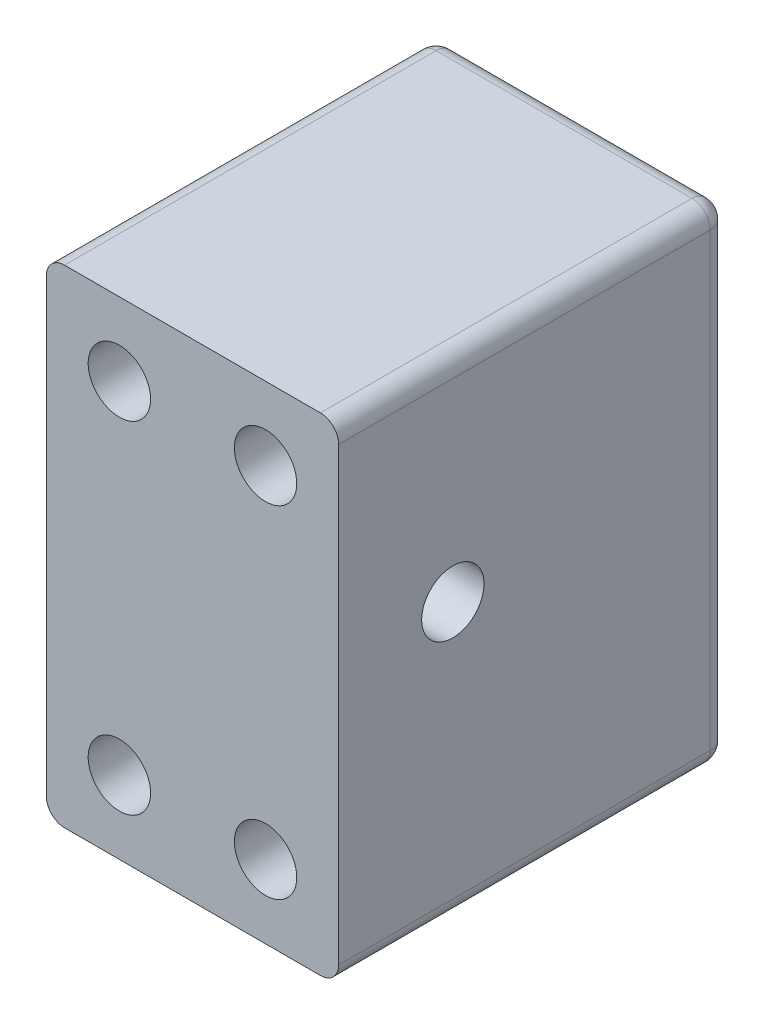
ISO-10303-21;
HEADER;
FILE_DESCRIPTION(('STEP AP214'),'2;1');
FILE_NAME('part.step','',(''),(''),'','','');
FILE_SCHEMA(('AUTOMOTIVE_DESIGN { 1 0 10303 214 1 1 1 1 }'));
ENDSEC;
DATA;
#1=APPLICATION_CONTEXT('core data for automotive mechanical design processes');
#2=APPLICATION_PROTOCOL_DEFINITION('international standard','automotive_design',2000,#1);
#3=PRODUCT_CONTEXT('',#1,'mechanical');
#4=PRODUCT('Part','Part','',(#3));
#5=PRODUCT_RELATED_PRODUCT_CATEGORY('part','',(#4));
#6=PRODUCT_DEFINITION_FORMATION('','',#4);
#7=PRODUCT_DEFINITION_CONTEXT('part definition',#1,'design');
#8=PRODUCT_DEFINITION('design','',#6,#7);
#9=PRODUCT_DEFINITION_SHAPE('','',#8);
#10=(LENGTH_UNIT() NAMED_UNIT(*) SI_UNIT(.MILLI.,.METRE.));
#11=(NAMED_UNIT(*) PLANE_ANGLE_UNIT() SI_UNIT($,.RADIAN.));
#12=(NAMED_UNIT(*) SI_UNIT($,.STERADIAN.) SOLID_ANGLE_UNIT());
#13=UNCERTAINTY_MEASURE_WITH_UNIT(LENGTH_MEASURE(1.E-05),#10,'distance_accuracy_value','');
#14=(GEOMETRIC_REPRESENTATION_CONTEXT(3) GLOBAL_UNCERTAINTY_ASSIGNED_CONTEXT((#13)) GLOBAL_UNIT_ASSIGNED_CONTEXT((#10,
#11,#12)) REPRESENTATION_CONTEXT('',''));
#15=CARTESIAN_POINT('',(0.,0.,0.));
#16=DIRECTION('',(0.,0.,1.));
#17=DIRECTION('',(1.,0.,0.));
#18=AXIS2_PLACEMENT_3D('',#15,#16,#17);
#19=CARTESIAN_POINT('',(0.,0.,25.4));
#20=DIRECTION('',(0.,0.,-1.));
#21=DIRECTION('',(-1.,0.,0.));
#22=AXIS2_PLACEMENT_3D('',#19,#20,#21);
#23=PLANE('',#22);
#24=DIRECTION('',(0.,-1.,0.));
#25=VECTOR('',#24,1.);
#26=CARTESIAN_POINT('',(0.,0.,25.4));
#27=LINE('',#26,#25);
#28=CARTESIAN_POINT('',(0.,30.559375,25.4));
#29=VERTEX_POINT('',#28);
#30=CARTESIAN_POINT('',(0.,1.190625,25.4));
#31=VERTEX_POINT('',#30);
#32=EDGE_CURVE('E155',#29,#31,#27,.T.);
#33=ORIENTED_EDGE('',*,*,#32,.T.);
#34=CARTESIAN_POINT('',(1.190625,1.190625,25.4));
#35=DIRECTION('',(0.,0.,-1.));
#36=DIRECTION('',(-1.,0.,0.));
#37=AXIS2_PLACEMENT_3D('',#34,#35,#36);
#38=CIRCLE('',#37,1.190625);
#39=CARTESIAN_POINT('',(1.190625,0.,25.4));
#40=VERTEX_POINT('',#39);
#41=EDGE_CURVE('E149',#31,#40,#38,.F.);
#42=ORIENTED_EDGE('',*,*,#41,.T.);
#43=DIRECTION('',(1.,0.,0.));
#44=VECTOR('',#43,1.);
#45=CARTESIAN_POINT('',(0.,0.,25.4));
#46=LINE('',#45,#44);
#47=CARTESIAN_POINT('',(17.859375,0.,25.4));
#48=VERTEX_POINT('',#47);
#49=EDGE_CURVE('E148',#40,#48,#46,.T.);
#50=ORIENTED_EDGE('',*,*,#49,.T.);
#51=CARTESIAN_POINT('',(17.859375,1.190625,25.4));
#52=DIRECTION('',(0.,0.,-1.));
#53=DIRECTION('',(-1.,0.,0.));
#54=AXIS2_PLACEMENT_3D('',#51,#52,#53);
#55=CIRCLE('',#54,1.190625);
#56=CARTESIAN_POINT('',(19.05,1.190625,25.4));
#57=VERTEX_POINT('',#56);
#58=EDGE_CURVE('E159',#48,#57,#55,.F.);
#59=ORIENTED_EDGE('',*,*,#58,.T.);
#60=DIRECTION('',(0.,1.,0.));
#61=VECTOR('',#60,1.);
#62=CARTESIAN_POINT('',(19.05,0.,25.4));
#63=LINE('',#62,#61);
#64=CARTESIAN_POINT('',(19.05,30.559375,25.4));
#65=VERTEX_POINT('',#64);
#66=EDGE_CURVE('E170',#57,#65,#63,.T.);
#67=ORIENTED_EDGE('',*,*,#66,.T.);
#68=CARTESIAN_POINT('',(17.859375,30.559375,25.4));
#69=DIRECTION('',(0.,0.,-1.));
#70=DIRECTION('',(-1.,0.,0.));
#71=AXIS2_PLACEMENT_3D('',#68,#69,#70);
#72=CIRCLE('',#71,1.190625);
#73=CARTESIAN_POINT('',(17.859375,31.75,25.4));
#74=VERTEX_POINT('',#73);
#75=EDGE_CURVE('E194',#65,#74,#72,.F.);
#76=ORIENTED_EDGE('',*,*,#75,.T.);
#77=DIRECTION('',(-1.,0.,0.));
#78=VECTOR('',#77,1.);
#79=CARTESIAN_POINT('',(0.,31.75,25.4));
#80=LINE('',#79,#78);
#81=CARTESIAN_POINT('',(1.190625,31.75,25.4));
#82=VERTEX_POINT('',#81);
#83=EDGE_CURVE('E312',#74,#82,#80,.T.);
#84=ORIENTED_EDGE('',*,*,#83,.T.);
#85=CARTESIAN_POINT('',(1.190625,30.559375,25.4));
#86=DIRECTION('',(0.,0.,-1.));
#87=DIRECTION('',(-1.,0.,0.));
#88=AXIS2_PLACEMENT_3D('',#85,#86,#87);
#89=CIRCLE('',#88,1.190625);
#90=EDGE_CURVE('E193',#82,#29,#89,.F.);
#91=ORIENTED_EDGE('',*,*,#90,.T.);
#92=EDGE_LOOP('',(#33,#42,#50,#59,#67,#76,#84,#91));
#93=FACE_BOUND('',#92,.T.);
#94=CARTESIAN_POINT('',(4.7625,26.9875,25.4));
#95=DIRECTION('',(0.,0.,1.));
#96=DIRECTION('',(1.,0.,0.));
#97=AXIS2_PLACEMENT_3D('',#94,#95,#96);
#98=CIRCLE('',#97,2.032);
#99=CARTESIAN_POINT('',(6.7945,26.9875,25.4));
#100=VERTEX_POINT('',#99);
#101=EDGE_CURVE('E305',#100,#100,#98,.T.);
#102=ORIENTED_EDGE('',*,*,#101,.F.);
#103=EDGE_LOOP('',(#102));
#104=FACE_BOUND('',#103,.T.);
#105=CARTESIAN_POINT('',(14.2875,26.9875,25.4));
#106=DIRECTION('',(0.,0.,1.));
#107=DIRECTION('',(1.,0.,0.));
#108=AXIS2_PLACEMENT_3D('',#105,#106,#107);
#109=CIRCLE('',#108,2.032);
#110=CARTESIAN_POINT('',(16.3195,26.9875,25.4));
#111=VERTEX_POINT('',#110);
#112=EDGE_CURVE('E295',#111,#111,#109,.T.);
#113=ORIENTED_EDGE('',*,*,#112,.F.);
#114=EDGE_LOOP('',(#113));
#115=FACE_BOUND('',#114,.T.);
#116=CARTESIAN_POINT('',(4.76250000000001,4.7625,25.4));
#117=DIRECTION('',(0.,0.,1.));
#118=DIRECTION('',(1.,0.,0.));
#119=AXIS2_PLACEMENT_3D('',#116,#117,#118);
#120=CIRCLE('',#119,2.032);
#121=CARTESIAN_POINT('',(6.79450000000001,4.7625,25.4));
#122=VERTEX_POINT('',#121);
#123=EDGE_CURVE('E290',#122,#122,#120,.T.);
#124=ORIENTED_EDGE('',*,*,#123,.F.);
#125=EDGE_LOOP('',(#124));
#126=FACE_BOUND('',#125,.T.);
#127=CARTESIAN_POINT('',(14.2875,4.7625,25.4));
#128=DIRECTION('',(0.,0.,1.));
#129=DIRECTION('',(1.,0.,0.));
#130=AXIS2_PLACEMENT_3D('',#127,#128,#129);
#131=CIRCLE('',#130,2.032);
#132=CARTESIAN_POINT('',(16.3195,4.7625,25.4));
#133=VERTEX_POINT('',#132);
#134=EDGE_CURVE('E278',#133,#133,#131,.T.);
#135=ORIENTED_EDGE('',*,*,#134,.F.);
#136=EDGE_LOOP('',(#135));
#137=FACE_BOUND('',#136,.T.);
#138=ADVANCED_FACE('F44',(#93,#104,#115,#126,#137),#23,.F.);
#139=CARTESIAN_POINT('',(0.,0.,0.));
#140=DIRECTION('',(0.,0.,-1.));
#141=DIRECTION('',(-1.,0.,0.));
#142=AXIS2_PLACEMENT_3D('',#139,#140,#141);
#143=PLANE('',#142);
#144=DIRECTION('',(0.,-1.,0.));
#145=VECTOR('',#144,1.);
#146=CARTESIAN_POINT('',(1.190625,31.75,0.));
#147=LINE('',#146,#145);
#148=CARTESIAN_POINT('',(1.190625,1.190625,0.));
#149=VERTEX_POINT('',#148);
#150=CARTESIAN_POINT('',(1.190625,30.559375,0.));
#151=VERTEX_POINT('',#150);
#152=EDGE_CURVE('E73',#149,#151,#147,.F.);
#153=ORIENTED_EDGE('',*,*,#152,.T.);
#154=DIRECTION('',(-1.,0.,0.));
#155=VECTOR('',#154,1.);
#156=CARTESIAN_POINT('',(19.05,30.559375,0.));
#157=LINE('',#156,#155);
#158=CARTESIAN_POINT('',(17.859375,30.559375,0.));
#159=VERTEX_POINT('',#158);
#160=EDGE_CURVE('E11',#151,#159,#157,.F.);
#161=ORIENTED_EDGE('',*,*,#160,.T.);
#162=DIRECTION('',(0.,1.,0.));
#163=VECTOR('',#162,1.);
#164=CARTESIAN_POINT('',(17.859375,0.,0.));
#165=LINE('',#164,#163);
#166=CARTESIAN_POINT('',(17.859375,1.190625,0.));
#167=VERTEX_POINT('',#166);
#168=EDGE_CURVE('E54',#159,#167,#165,.F.);
#169=ORIENTED_EDGE('',*,*,#168,.T.);
#170=DIRECTION('',(1.,0.,0.));
#171=VECTOR('',#170,1.);
#172=CARTESIAN_POINT('',(0.,1.190625,0.));
#173=LINE('',#172,#171);
#174=EDGE_CURVE('E213',#167,#149,#173,.F.);
#175=ORIENTED_EDGE('',*,*,#174,.T.);
#176=EDGE_LOOP('',(#153,#161,#169,#175));
#177=FACE_BOUND('',#176,.T.);
#178=CARTESIAN_POINT('',(4.76250000000001,4.7625,0.));
#179=DIRECTION('',(0.,0.,1.));
#180=DIRECTION('',(1.,0.,0.));
#181=AXIS2_PLACEMENT_3D('',#178,#179,#180);
#182=CIRCLE('',#181,2.032);
#183=CARTESIAN_POINT('',(6.79450000000001,4.7625,0.));
#184=VERTEX_POINT('',#183);
#185=EDGE_CURVE('E282',#184,#184,#182,.T.);
#186=ORIENTED_EDGE('',*,*,#185,.T.);
#187=EDGE_LOOP('',(#186));
#188=FACE_BOUND('',#187,.T.);
#189=CARTESIAN_POINT('',(4.7625,26.9875,0.));
#190=DIRECTION('',(0.,0.,1.));
#191=DIRECTION('',(1.,0.,0.));
#192=AXIS2_PLACEMENT_3D('',#189,#190,#191);
#193=CIRCLE('',#192,2.032);
#194=CARTESIAN_POINT('',(6.7945,26.9875,0.));
#195=VERTEX_POINT('',#194);
#196=EDGE_CURVE('E296',#195,#195,#193,.T.);
#197=ORIENTED_EDGE('',*,*,#196,.T.);
#198=EDGE_LOOP('',(#197));
#199=FACE_BOUND('',#198,.T.);
#200=CARTESIAN_POINT('',(14.2875,26.9875,0.));
#201=DIRECTION('',(0.,0.,1.));
#202=DIRECTION('',(1.,0.,0.));
#203=AXIS2_PLACEMENT_3D('',#200,#201,#202);
#204=CIRCLE('',#203,2.032);
#205=CARTESIAN_POINT('',(16.3195,26.9875,0.));
#206=VERTEX_POINT('',#205);
#207=EDGE_CURVE('E288',#206,#206,#204,.T.);
#208=ORIENTED_EDGE('',*,*,#207,.T.);
#209=EDGE_LOOP('',(#208));
#210=FACE_BOUND('',#209,.T.);
#211=CARTESIAN_POINT('',(14.2875,4.7625,0.));
#212=DIRECTION('',(0.,0.,1.));
#213=DIRECTION('',(1.,0.,0.));
#214=AXIS2_PLACEMENT_3D('',#211,#212,#213);
#215=CIRCLE('',#214,2.032);
#216=CARTESIAN_POINT('',(16.3195,4.7625,0.));
#217=VERTEX_POINT('',#216);
#218=EDGE_CURVE('E279',#217,#217,#215,.T.);
#219=ORIENTED_EDGE('',*,*,#218,.T.);
#220=EDGE_LOOP('',(#219));
#221=FACE_BOUND('',#220,.T.);
#222=ADVANCED_FACE('F328',(#177,#188,#199,#210,#221),#143,.T.);
#223=CARTESIAN_POINT('',(0.,0.,25.4));
#224=DIRECTION('',(1.,0.,0.));
#225=DIRECTION('',(0.,0.,-1.));
#226=AXIS2_PLACEMENT_3D('',#223,#224,#225);
#227=PLANE('',#226);
#228=CARTESIAN_POINT('',(0.,17.9605122421382,17.9605122421384));
#229=DIRECTION('',(-1.,0.,0.));
#230=DIRECTION('',(0.,0.,1.));
#231=AXIS2_PLACEMENT_3D('',#228,#229,#230);
#232=CIRCLE('',#231,2.032);
#233=CARTESIAN_POINT('',(0.,17.9605122421382,19.9925122421384));
#234=VERTEX_POINT('',#233);
#235=EDGE_CURVE('E265',#234,#234,#232,.T.);
#236=ORIENTED_EDGE('',*,*,#235,.F.);
#237=EDGE_LOOP('',(#236));
#238=FACE_BOUND('',#237,.T.);
#239=DIRECTION('',(0.,-1.,0.));
#240=VECTOR('',#239,1.);
#241=CARTESIAN_POINT('',(0.,0.,1.190625));
#242=LINE('',#241,#240);
#243=CARTESIAN_POINT('',(0.,30.559375,1.190625));
#244=VERTEX_POINT('',#243);
#245=CARTESIAN_POINT('',(0.,1.190625,1.190625));
#246=VERTEX_POINT('',#245);
#247=EDGE_CURVE('E172',#244,#246,#242,.T.);
#248=ORIENTED_EDGE('',*,*,#247,.T.);
#249=DIRECTION('',(0.,0.,-1.));
#250=VECTOR('',#249,1.);
#251=CARTESIAN_POINT('',(0.,1.190625,25.4));
#252=LINE('',#251,#250);
#253=EDGE_CURVE('E189',#246,#31,#252,.F.);
#254=ORIENTED_EDGE('',*,*,#253,.T.);
#255=ORIENTED_EDGE('',*,*,#32,.F.);
#256=DIRECTION('',(0.,0.,-1.));
#257=VECTOR('',#256,1.);
#258=CARTESIAN_POINT('',(0.,30.559375,25.4));
#259=LINE('',#258,#257);
#260=EDGE_CURVE('E177',#29,#244,#259,.T.);
#261=ORIENTED_EDGE('',*,*,#260,.T.);
#262=EDGE_LOOP('',(#248,#254,#255,#261));
#263=FACE_BOUND('',#262,.T.);
#264=ADVANCED_FACE('F360',(#238,#263),#227,.F.);
#265=CARTESIAN_POINT('',(0.,0.,25.4));
#266=DIRECTION('',(0.,1.,0.));
#267=DIRECTION('',(0.,0.,1.));
#268=AXIS2_PLACEMENT_3D('',#265,#266,#267);
#269=PLANE('',#268);
#270=ORIENTED_EDGE('',*,*,#49,.F.);
#271=DIRECTION('',(0.,0.,-1.));
#272=VECTOR('',#271,1.);
#273=CARTESIAN_POINT('',(1.190625,0.,25.4));
#274=LINE('',#273,#272);
#275=CARTESIAN_POINT('',(1.190625,0.,1.190625));
#276=VERTEX_POINT('',#275);
#277=EDGE_CURVE('E161',#40,#276,#274,.T.);
#278=ORIENTED_EDGE('',*,*,#277,.T.);
#279=DIRECTION('',(1.,0.,0.));
#280=VECTOR('',#279,1.);
#281=CARTESIAN_POINT('',(19.05,0.,1.190625));
#282=LINE('',#281,#280);
#283=CARTESIAN_POINT('',(17.859375,0.,1.190625));
#284=VERTEX_POINT('',#283);
#285=EDGE_CURVE('E185',#276,#284,#282,.T.);
#286=ORIENTED_EDGE('',*,*,#285,.T.);
#287=DIRECTION('',(0.,0.,-1.));
#288=VECTOR('',#287,1.);
#289=CARTESIAN_POINT('',(17.859375,0.,25.4));
#290=LINE('',#289,#288);
#291=EDGE_CURVE('E164',#284,#48,#290,.F.);
#292=ORIENTED_EDGE('',*,*,#291,.T.);
#293=EDGE_LOOP('',(#270,#278,#286,#292));
#294=FACE_BOUND('',#293,.T.);
#295=ADVANCED_FACE('F162',(#294),#269,.F.);
#296=CARTESIAN_POINT('',(19.05,0.,25.4));
#297=DIRECTION('',(-1.,0.,0.));
#298=DIRECTION('',(0.,0.,1.));
#299=AXIS2_PLACEMENT_3D('',#296,#297,#298);
#300=PLANE('',#299);
#301=ORIENTED_EDGE('',*,*,#66,.F.);
#302=DIRECTION('',(0.,0.,-1.));
#303=VECTOR('',#302,1.);
#304=CARTESIAN_POINT('',(19.05,1.190625,25.4));
#305=LINE('',#304,#303);
#306=CARTESIAN_POINT('',(19.05,1.190625,1.190625));
#307=VERTEX_POINT('',#306);
#308=EDGE_CURVE('E204',#57,#307,#305,.T.);
#309=ORIENTED_EDGE('',*,*,#308,.T.);
#310=DIRECTION('',(0.,1.,0.));
#311=VECTOR('',#310,1.);
#312=CARTESIAN_POINT('',(19.05,31.75,1.190625));
#313=LINE('',#312,#311);
#314=CARTESIAN_POINT('',(19.05,30.559375,1.190625));
#315=VERTEX_POINT('',#314);
#316=EDGE_CURVE('E160',#307,#315,#313,.T.);
#317=ORIENTED_EDGE('',*,*,#316,.T.);
#318=DIRECTION('',(0.,0.,-1.));
#319=VECTOR('',#318,1.);
#320=CARTESIAN_POINT('',(19.05,30.559375,25.4));
#321=LINE('',#320,#319);
#322=EDGE_CURVE('E199',#315,#65,#321,.F.);
#323=ORIENTED_EDGE('',*,*,#322,.T.);
#324=EDGE_LOOP('',(#301,#309,#317,#323));
#325=FACE_BOUND('',#324,.T.);
#326=CARTESIAN_POINT('',(19.05,17.9605122421382,17.9605122421384));
#327=DIRECTION('',(-1.,0.,0.));
#328=DIRECTION('',(0.,0.,1.));
#329=AXIS2_PLACEMENT_3D('',#326,#327,#328);
#330=CIRCLE('',#329,2.032);
#331=CARTESIAN_POINT('',(19.05,17.9605122421382,19.9925122421384));
#332=VERTEX_POINT('',#331);
#333=EDGE_CURVE('E269',#332,#332,#330,.T.);
#334=ORIENTED_EDGE('',*,*,#333,.T.);
#335=EDGE_LOOP('',(#334));
#336=FACE_BOUND('',#335,.T.);
#337=ADVANCED_FACE('F370',(#325,#336),#300,.F.);
#338=CARTESIAN_POINT('',(0.,31.75,25.4));
#339=DIRECTION('',(0.,-1.,0.));
#340=DIRECTION('',(0.,0.,-1.));
#341=AXIS2_PLACEMENT_3D('',#338,#339,#340);
#342=PLANE('',#341);
#343=DIRECTION('',(-1.,0.,0.));
#344=VECTOR('',#343,1.);
#345=CARTESIAN_POINT('',(0.,31.75,1.190625));
#346=LINE('',#345,#344);
#347=CARTESIAN_POINT('',(17.859375,31.75,1.190625));
#348=VERTEX_POINT('',#347);
#349=CARTESIAN_POINT('',(1.190625,31.75,1.190625));
#350=VERTEX_POINT('',#349);
#351=EDGE_CURVE('E207',#348,#350,#346,.T.);
#352=ORIENTED_EDGE('',*,*,#351,.T.);
#353=DIRECTION('',(0.,0.,-1.));
#354=VECTOR('',#353,1.);
#355=CARTESIAN_POINT('',(1.190625,31.75,25.4));
#356=LINE('',#355,#354);
#357=EDGE_CURVE('E211',#350,#82,#356,.F.);
#358=ORIENTED_EDGE('',*,*,#357,.T.);
#359=ORIENTED_EDGE('',*,*,#83,.F.);
#360=DIRECTION('',(0.,0.,-1.));
#361=VECTOR('',#360,1.);
#362=CARTESIAN_POINT('',(17.859375,31.75,25.4));
#363=LINE('',#362,#361);
#364=EDGE_CURVE('E209',#74,#348,#363,.T.);
#365=ORIENTED_EDGE('',*,*,#364,.T.);
#366=EDGE_LOOP('',(#352,#358,#359,#365));
#367=FACE_BOUND('',#366,.T.);
#368=ADVANCED_FACE('F362',(#367),#342,.F.);
#369=CARTESIAN_POINT('',(4.7625,26.9875,25.4));
#370=DIRECTION('',(0.,0.,-1.));
#371=DIRECTION('',(-1.,0.,0.));
#372=AXIS2_PLACEMENT_3D('',#369,#370,#371);
#373=CYLINDRICAL_SURFACE('',#372,2.032);
#374=ORIENTED_EDGE('',*,*,#101,.T.);
#375=EDGE_LOOP('',(#374));
#376=FACE_BOUND('',#375,.T.);
#377=ORIENTED_EDGE('',*,*,#196,.F.);
#378=EDGE_LOOP('',(#377));
#379=FACE_BOUND('',#378,.T.);
#380=ADVANCED_FACE('F365',(#376,#379),#373,.F.);
#381=CARTESIAN_POINT('',(14.2875,26.9875,25.4));
#382=DIRECTION('',(0.,0.,-1.));
#383=DIRECTION('',(-1.,0.,0.));
#384=AXIS2_PLACEMENT_3D('',#381,#382,#383);
#385=CYLINDRICAL_SURFACE('',#384,2.032);
#386=ORIENTED_EDGE('',*,*,#112,.T.);
#387=EDGE_LOOP('',(#386));
#388=FACE_BOUND('',#387,.T.);
#389=ORIENTED_EDGE('',*,*,#207,.F.);
#390=EDGE_LOOP('',(#389));
#391=FACE_BOUND('',#390,.T.);
#392=ADVANCED_FACE('F507',(#388,#391),#385,.F.);
#393=CARTESIAN_POINT('',(4.76250000000001,4.7625,25.4));
#394=DIRECTION('',(0.,0.,-1.));
#395=DIRECTION('',(-1.,0.,0.));
#396=AXIS2_PLACEMENT_3D('',#393,#394,#395);
#397=CYLINDRICAL_SURFACE('',#396,2.032);
#398=ORIENTED_EDGE('',*,*,#123,.T.);
#399=EDGE_LOOP('',(#398));
#400=FACE_BOUND('',#399,.T.);
#401=ORIENTED_EDGE('',*,*,#185,.F.);
#402=EDGE_LOOP('',(#401));
#403=FACE_BOUND('',#402,.T.);
#404=ADVANCED_FACE('F512',(#400,#403),#397,.F.);
#405=CARTESIAN_POINT('',(14.2875,4.7625,25.4));
#406=DIRECTION('',(0.,0.,-1.));
#407=DIRECTION('',(-1.,0.,0.));
#408=AXIS2_PLACEMENT_3D('',#405,#406,#407);
#409=CYLINDRICAL_SURFACE('',#408,2.032);
#410=ORIENTED_EDGE('',*,*,#134,.T.);
#411=EDGE_LOOP('',(#410));
#412=FACE_BOUND('',#411,.T.);
#413=ORIENTED_EDGE('',*,*,#218,.F.);
#414=EDGE_LOOP('',(#413));
#415=FACE_BOUND('',#414,.T.);
#416=ADVANCED_FACE('F404',(#412,#415),#409,.F.);
#417=CARTESIAN_POINT('',(19.05,17.9605122421382,17.9605122421384));
#418=DIRECTION('',(-1.,0.,0.));
#419=DIRECTION('',(0.,0.,1.));
#420=AXIS2_PLACEMENT_3D('',#417,#418,#419);
#421=CYLINDRICAL_SURFACE('',#420,2.032);
#422=CARTESIAN_POINT('',(19.05,17.9605122421382,19.9925122421384));
#423=CARTESIAN_POINT('',(18.8515625,17.9605122421382,19.9925122421384));
#424=CARTESIAN_POINT('',(18.653125,17.9605122421382,19.9925122421384));
#425=CARTESIAN_POINT('',(18.25625,17.9605122421382,19.9925122421384));
#426=CARTESIAN_POINT('',(18.0578125,17.9605122421382,19.9925122421384));
#427=CARTESIAN_POINT('',(17.6609375,17.9605122421382,19.9925122421384));
#428=CARTESIAN_POINT('',(17.4625,17.9605122421382,19.9925122421384));
#429=CARTESIAN_POINT('',(17.065625,17.9605122421382,19.9925122421384));
#430=CARTESIAN_POINT('',(16.8671875,17.9605122421382,19.9925122421384));
#431=CARTESIAN_POINT('',(16.4703125,17.9605122421382,19.9925122421384));
#432=CARTESIAN_POINT('',(16.271875,17.9605122421382,19.9925122421384));
#433=CARTESIAN_POINT('',(15.875,17.9605122421382,19.9925122421384));
#434=CARTESIAN_POINT('',(15.6765625,17.9605122421382,19.9925122421384));
#435=CARTESIAN_POINT('',(15.2796875,17.9605122421382,19.9925122421384));
#436=CARTESIAN_POINT('',(15.08125,17.9605122421382,19.9925122421384));
#437=CARTESIAN_POINT('',(14.684375,17.9605122421382,19.9925122421384));
#438=CARTESIAN_POINT('',(14.4859375,17.9605122421382,19.9925122421384));
#439=CARTESIAN_POINT('',(14.0890625,17.9605122421382,19.9925122421384));
#440=CARTESIAN_POINT('',(13.890625,17.9605122421382,19.9925122421384));
#441=CARTESIAN_POINT('',(13.49375,17.9605122421382,19.9925122421384));
#442=CARTESIAN_POINT('',(13.2953125,17.9605122421382,19.9925122421384));
#443=CARTESIAN_POINT('',(12.8984375,17.9605122421382,19.9925122421384));
#444=CARTESIAN_POINT('',(12.7,17.9605122421382,19.9925122421384));
#445=CARTESIAN_POINT('',(12.303125,17.9605122421382,19.9925122421384));
#446=CARTESIAN_POINT('',(12.1046875,17.9605122421382,19.9925122421384));
#447=CARTESIAN_POINT('',(11.7078125,17.9605122421382,19.9925122421384));
#448=CARTESIAN_POINT('',(11.509375,17.9605122421382,19.9925122421384));
#449=CARTESIAN_POINT('',(11.1125,17.9605122421382,19.9925122421384));
#450=CARTESIAN_POINT('',(10.9140625,17.9605122421382,19.9925122421384));
#451=CARTESIAN_POINT('',(10.5171875,17.9605122421382,19.9925122421384));
#452=CARTESIAN_POINT('',(10.31875,17.9605122421382,19.9925122421384));
#453=CARTESIAN_POINT('',(9.921875,17.9605122421382,19.9925122421384));
#454=CARTESIAN_POINT('',(9.7234375,17.9605122421382,19.9925122421384));
#455=CARTESIAN_POINT('',(9.3265625,17.9605122421382,19.9925122421384));
#456=CARTESIAN_POINT('',(9.128125,17.9605122421382,19.9925122421384));
#457=CARTESIAN_POINT('',(8.73125,17.9605122421382,19.9925122421384));
#458=CARTESIAN_POINT('',(8.5328125,17.9605122421382,19.9925122421384));
#459=CARTESIAN_POINT('',(8.1359375,17.9605122421382,19.9925122421384));
#460=CARTESIAN_POINT('',(7.9375,17.9605122421382,19.9925122421384));
#461=CARTESIAN_POINT('',(7.540625,17.9605122421382,19.9925122421384));
#462=CARTESIAN_POINT('',(7.3421875,17.9605122421382,19.9925122421384));
#463=CARTESIAN_POINT('',(6.9453125,17.9605122421382,19.9925122421384));
#464=CARTESIAN_POINT('',(6.746875,17.9605122421382,19.9925122421384));
#465=CARTESIAN_POINT('',(6.35,17.9605122421382,19.9925122421384));
#466=CARTESIAN_POINT('',(6.1515625,17.9605122421382,19.9925122421384));
#467=CARTESIAN_POINT('',(5.7546875,17.9605122421382,19.9925122421384));
#468=CARTESIAN_POINT('',(5.55625,17.9605122421382,19.9925122421384));
#469=CARTESIAN_POINT('',(5.159375,17.9605122421382,19.9925122421384));
#470=CARTESIAN_POINT('',(4.9609375,17.9605122421382,19.9925122421384));
#471=CARTESIAN_POINT('',(4.5640625,17.9605122421382,19.9925122421384));
#472=CARTESIAN_POINT('',(4.365625,17.9605122421382,19.9925122421384));
#473=CARTESIAN_POINT('',(3.96875,17.9605122421382,19.9925122421384));
#474=CARTESIAN_POINT('',(3.7703125,17.9605122421382,19.9925122421384));
#475=CARTESIAN_POINT('',(3.3734375,17.9605122421382,19.9925122421384));
#476=CARTESIAN_POINT('',(3.175,17.9605122421382,19.9925122421384));
#477=CARTESIAN_POINT('',(2.778125,17.9605122421382,19.9925122421384));
#478=CARTESIAN_POINT('',(2.5796875,17.9605122421382,19.9925122421384));
#479=CARTESIAN_POINT('',(2.1828125,17.9605122421382,19.9925122421384));
#480=CARTESIAN_POINT('',(1.984375,17.9605122421382,19.9925122421384));
#481=CARTESIAN_POINT('',(1.5875,17.9605122421382,19.9925122421384));
#482=CARTESIAN_POINT('',(1.3890625,17.9605122421382,19.9925122421384));
#483=CARTESIAN_POINT('',(0.992187500000001,17.9605122421382,19.9925122421384));
#484=CARTESIAN_POINT('',(0.793750000000001,17.9605122421382,19.9925122421384));
#485=CARTESIAN_POINT('',(0.396875,17.9605122421382,19.9925122421384));
#486=CARTESIAN_POINT('',(0.1984375,17.9605122421382,19.9925122421384));
#487=CARTESIAN_POINT('',(0.,17.9605122421382,19.9925122421384));
#488=B_SPLINE_CURVE_WITH_KNOTS('',3,(#422,#423,#424,#425,#426,#427,#428,#429,#430,#431,#432,
#433,#434,#435,#436,#437,#438,#439,#440,#441,#442,#443,#444,#445,#446,#447,#448,#449,#450,#451,
#452,#453,#454,#455,#456,#457,#458,#459,#460,#461,#462,#463,#464,#465,#466,#467,#468,#469,#470,
#471,#472,#473,#474,#475,#476,#477,#478,#479,#480,#481,#482,#483,#484,#485,#486,#487),
.UNSPECIFIED.,.F.,.F.,(4,2,2,2,2,2,2,2,2,2,2,2,2,2,2,2,2,2,2,2,2,2,2,2,2,2,2,2,2,2,2,2,4),(0.,
0.595312499999997,1.190625,1.7859375,2.38125,2.9765625,3.571875,4.1671875,4.7625,5.3578125,
5.953125,6.5484375,7.14375,7.7390625,8.334375,8.9296875,9.525,10.1203125,10.715625,11.3109375,
11.90625,12.5015625,13.096875,13.6921875,14.2875,14.8828125,15.478125,16.0734375,16.66875,
17.2640625,17.859375,18.4546875,19.05),.UNSPECIFIED.);
#489=EDGE_CURVE('BSEAM352',#332,#234,#488,.T.);
#490=ORIENTED_EDGE('',*,*,#333,.F.);
#491=ORIENTED_EDGE('',*,*,#235,.T.);
#492=ORIENTED_EDGE('',*,*,#489,.T.);
#493=ORIENTED_EDGE('',*,*,#489,.F.);
#494=EDGE_LOOP('',(#490,#492,#491,#493));
#495=FACE_BOUND('',#494,.T.);
#496=ADVANCED_FACE('F352',(#495),#421,.F.);
#497=CARTESIAN_POINT('',(17.859375,30.559375,25.4));
#498=DIRECTION('',(0.,0.,-1.));
#499=DIRECTION('',(-1.,0.,0.));
#500=AXIS2_PLACEMENT_3D('',#497,#498,#499);
#501=CYLINDRICAL_SURFACE('',#500,1.190625);
#502=CARTESIAN_POINT('',(17.859375,30.559375,1.190625));
#503=DIRECTION('',(0.,0.,-1.));
#504=DIRECTION('',(-1.,0.,0.));
#505=AXIS2_PLACEMENT_3D('',#502,#503,#504);
#506=CIRCLE('',#505,1.190625);
#507=EDGE_CURVE('E47',#348,#315,#506,.T.);
#508=ORIENTED_EDGE('',*,*,#507,.F.);
#509=ORIENTED_EDGE('',*,*,#364,.F.);
#510=ORIENTED_EDGE('',*,*,#75,.F.);
#511=ORIENTED_EDGE('',*,*,#322,.F.);
#512=EDGE_LOOP('',(#508,#509,#510,#511));
#513=FACE_BOUND('',#512,.T.);
#514=ADVANCED_FACE('F50',(#513),#501,.T.);
#515=CARTESIAN_POINT('',(17.859375,30.559375,1.190625));
#516=DIRECTION('',(1.,0.,0.));
#517=DIRECTION('',(0.,0.,-1.));
#518=AXIS2_PLACEMENT_3D('',#515,#516,#517);
#519=SPHERICAL_SURFACE('',#518,1.190625);
#520=CARTESIAN_POINT('',(17.859375,30.559375,1.190625));
#521=DIRECTION('',(1.,0.,0.));
#522=DIRECTION('',(0.,0.,-1.));
#523=AXIS2_PLACEMENT_3D('',#520,#521,#522);
#524=CIRCLE('',#523,1.190625);
#525=EDGE_CURVE('E251',#348,#159,#524,.F.);
#526=ORIENTED_EDGE('',*,*,#525,.F.);
#527=ORIENTED_EDGE('',*,*,#507,.T.);
#528=CARTESIAN_POINT('',(17.859375,30.559375,1.190625));
#529=DIRECTION('',(0.,1.,0.));
#530=DIRECTION('',(0.,0.,1.));
#531=AXIS2_PLACEMENT_3D('',#528,#529,#530);
#532=CIRCLE('',#531,1.190625);
#533=EDGE_CURVE('E256',#159,#315,#532,.F.);
#534=ORIENTED_EDGE('',*,*,#533,.F.);
#535=EDGE_LOOP('',(#526,#527,#534));
#536=FACE_BOUND('',#535,.T.);
#537=ADVANCED_FACE('F345',(#536),#519,.T.);
#538=CARTESIAN_POINT('',(17.859375,1.190625,25.4));
#539=DIRECTION('',(0.,0.,-1.));
#540=DIRECTION('',(-1.,0.,0.));
#541=AXIS2_PLACEMENT_3D('',#538,#539,#540);
#542=CYLINDRICAL_SURFACE('',#541,1.190625);
#543=ORIENTED_EDGE('',*,*,#58,.F.);
#544=ORIENTED_EDGE('',*,*,#291,.F.);
#545=CARTESIAN_POINT('',(17.859375,1.190625,1.190625));
#546=DIRECTION('',(0.,0.,-1.));
#547=DIRECTION('',(-1.,0.,0.));
#548=AXIS2_PLACEMENT_3D('',#545,#546,#547);
#549=CIRCLE('',#548,1.190625);
#550=EDGE_CURVE('E249',#307,#284,#549,.T.);
#551=ORIENTED_EDGE('',*,*,#550,.F.);
#552=ORIENTED_EDGE('',*,*,#308,.F.);
#553=EDGE_LOOP('',(#543,#544,#551,#552));
#554=FACE_BOUND('',#553,.T.);
#555=ADVANCED_FACE('F321',(#554),#542,.T.);
#556=CARTESIAN_POINT('',(17.859375,0.,1.190625));
#557=DIRECTION('',(0.,-1.,0.));
#558=DIRECTION('',(0.,0.,-1.));
#559=AXIS2_PLACEMENT_3D('',#556,#557,#558);
#560=CYLINDRICAL_SURFACE('',#559,1.190625);
#561=ORIENTED_EDGE('',*,*,#533,.T.);
#562=ORIENTED_EDGE('',*,*,#316,.F.);
#563=CARTESIAN_POINT('',(17.859375,1.190625,1.190625));
#564=DIRECTION('',(0.,-1.,0.));
#565=DIRECTION('',(0.,0.,-1.));
#566=AXIS2_PLACEMENT_3D('',#563,#564,#565);
#567=CIRCLE('',#566,1.190625);
#568=EDGE_CURVE('E246',#167,#307,#567,.T.);
#569=ORIENTED_EDGE('',*,*,#568,.F.);
#570=ORIENTED_EDGE('',*,*,#168,.F.);
#571=EDGE_LOOP('',(#561,#562,#569,#570));
#572=FACE_BOUND('',#571,.T.);
#573=ADVANCED_FACE('F348',(#572),#560,.T.);
#574=CARTESIAN_POINT('',(0.,30.559375,1.190625));
#575=DIRECTION('',(1.,0.,0.));
#576=DIRECTION('',(0.,0.,-1.));
#577=AXIS2_PLACEMENT_3D('',#574,#575,#576);
#578=CYLINDRICAL_SURFACE('',#577,1.190625);
#579=ORIENTED_EDGE('',*,*,#525,.T.);
#580=ORIENTED_EDGE('',*,*,#160,.F.);
#581=CARTESIAN_POINT('',(1.190625,30.559375,1.190625));
#582=DIRECTION('',(-1.,0.,0.));
#583=DIRECTION('',(0.,0.,1.));
#584=AXIS2_PLACEMENT_3D('',#581,#582,#583);
#585=CIRCLE('',#584,1.190625);
#586=EDGE_CURVE('E245',#350,#151,#585,.T.);
#587=ORIENTED_EDGE('',*,*,#586,.F.);
#588=ORIENTED_EDGE('',*,*,#351,.F.);
#589=EDGE_LOOP('',(#579,#580,#587,#588));
#590=FACE_BOUND('',#589,.T.);
#591=ADVANCED_FACE('F341',(#590),#578,.T.);
#592=CARTESIAN_POINT('',(1.190625,30.559375,25.4));
#593=DIRECTION('',(0.,0.,-1.));
#594=DIRECTION('',(-1.,0.,0.));
#595=AXIS2_PLACEMENT_3D('',#592,#593,#594);
#596=CYLINDRICAL_SURFACE('',#595,1.190625);
#597=ORIENTED_EDGE('',*,*,#90,.F.);
#598=ORIENTED_EDGE('',*,*,#357,.F.);
#599=CARTESIAN_POINT('',(1.190625,30.559375,1.190625));
#600=DIRECTION('',(0.,0.,-1.));
#601=DIRECTION('',(-1.,0.,0.));
#602=AXIS2_PLACEMENT_3D('',#599,#600,#601);
#603=CIRCLE('',#602,1.190625);
#604=EDGE_CURVE('E238',#244,#350,#603,.T.);
#605=ORIENTED_EDGE('',*,*,#604,.F.);
#606=ORIENTED_EDGE('',*,*,#260,.F.);
#607=EDGE_LOOP('',(#597,#598,#605,#606));
#608=FACE_BOUND('',#607,.T.);
#609=ADVANCED_FACE('F387',(#608),#596,.T.);
#610=CARTESIAN_POINT('',(17.859375,1.190625,1.190625));
#611=DIRECTION('',(1.,0.,0.));
#612=DIRECTION('',(0.,0.,-1.));
#613=AXIS2_PLACEMENT_3D('',#610,#611,#612);
#614=SPHERICAL_SURFACE('',#613,1.190625);
#615=ORIENTED_EDGE('',*,*,#568,.T.);
#616=ORIENTED_EDGE('',*,*,#550,.T.);
#617=CARTESIAN_POINT('',(17.859375,1.190625,1.190625));
#618=DIRECTION('',(1.,0.,0.));
#619=DIRECTION('',(0.,0.,-1.));
#620=AXIS2_PLACEMENT_3D('',#617,#618,#619);
#621=CIRCLE('',#620,1.190625);
#622=EDGE_CURVE('E234',#167,#284,#621,.F.);
#623=ORIENTED_EDGE('',*,*,#622,.F.);
#624=EDGE_LOOP('',(#615,#616,#623));
#625=FACE_BOUND('',#624,.T.);
#626=ADVANCED_FACE('F326',(#625),#614,.T.);
#627=CARTESIAN_POINT('',(1.190625,30.559375,1.190625));
#628=DIRECTION('',(0.,1.,0.));
#629=DIRECTION('',(0.,0.,1.));
#630=AXIS2_PLACEMENT_3D('',#627,#628,#629);
#631=SPHERICAL_SURFACE('',#630,1.190625);
#632=ORIENTED_EDGE('',*,*,#604,.T.);
#633=ORIENTED_EDGE('',*,*,#586,.T.);
#634=CARTESIAN_POINT('',(1.190625,30.559375,1.190625));
#635=DIRECTION('',(0.,1.,0.));
#636=DIRECTION('',(0.,0.,1.));
#637=AXIS2_PLACEMENT_3D('',#634,#635,#636);
#638=CIRCLE('',#637,1.190625);
#639=EDGE_CURVE('E229',#244,#151,#638,.F.);
#640=ORIENTED_EDGE('',*,*,#639,.F.);
#641=EDGE_LOOP('',(#632,#633,#640));
#642=FACE_BOUND('',#641,.T.);
#643=ADVANCED_FACE('F340',(#642),#631,.T.);
#644=CARTESIAN_POINT('',(0.,1.190625,1.190625));
#645=DIRECTION('',(-1.,0.,0.));
#646=DIRECTION('',(0.,0.,1.));
#647=AXIS2_PLACEMENT_3D('',#644,#645,#646);
#648=CYLINDRICAL_SURFACE('',#647,1.190625);
#649=ORIENTED_EDGE('',*,*,#622,.T.);
#650=ORIENTED_EDGE('',*,*,#285,.F.);
#651=CARTESIAN_POINT('',(1.190625,1.190625,1.190625));
#652=DIRECTION('',(-1.,0.,0.));
#653=DIRECTION('',(0.,0.,1.));
#654=AXIS2_PLACEMENT_3D('',#651,#652,#653);
#655=CIRCLE('',#654,1.190625);
#656=EDGE_CURVE('E227',#149,#276,#655,.T.);
#657=ORIENTED_EDGE('',*,*,#656,.F.);
#658=ORIENTED_EDGE('',*,*,#174,.F.);
#659=EDGE_LOOP('',(#649,#650,#657,#658));
#660=FACE_BOUND('',#659,.T.);
#661=ADVANCED_FACE('F327',(#660),#648,.T.);
#662=CARTESIAN_POINT('',(1.190625,0.,1.190625));
#663=DIRECTION('',(0.,1.,0.));
#664=DIRECTION('',(0.,0.,1.));
#665=AXIS2_PLACEMENT_3D('',#662,#663,#664);
#666=CYLINDRICAL_SURFACE('',#665,1.190625);
#667=ORIENTED_EDGE('',*,*,#639,.T.);
#668=ORIENTED_EDGE('',*,*,#152,.F.);
#669=CARTESIAN_POINT('',(1.190625,1.190625,1.190625));
#670=DIRECTION('',(0.,-1.,0.));
#671=DIRECTION('',(0.,0.,-1.));
#672=AXIS2_PLACEMENT_3D('',#669,#670,#671);
#673=CIRCLE('',#672,1.190625);
#674=EDGE_CURVE('E224',#246,#149,#673,.T.);
#675=ORIENTED_EDGE('',*,*,#674,.F.);
#676=ORIENTED_EDGE('',*,*,#247,.F.);
#677=EDGE_LOOP('',(#667,#668,#675,#676));
#678=FACE_BOUND('',#677,.T.);
#679=ADVANCED_FACE('F334',(#678),#666,.T.);
#680=CARTESIAN_POINT('',(1.190625,1.190625,1.190625));
#681=DIRECTION('',(0.,0.,-1.));
#682=DIRECTION('',(-1.,0.,0.));
#683=AXIS2_PLACEMENT_3D('',#680,#681,#682);
#684=SPHERICAL_SURFACE('',#683,1.190625);
#685=ORIENTED_EDGE('',*,*,#674,.T.);
#686=ORIENTED_EDGE('',*,*,#656,.T.);
#687=CARTESIAN_POINT('',(1.190625,1.190625,1.190625));
#688=DIRECTION('',(0.,0.,-1.));
#689=DIRECTION('',(-1.,0.,0.));
#690=AXIS2_PLACEMENT_3D('',#687,#688,#689);
#691=CIRCLE('',#690,1.190625);
#692=EDGE_CURVE('E171',#246,#276,#691,.F.);
#693=ORIENTED_EDGE('',*,*,#692,.F.);
#694=EDGE_LOOP('',(#685,#686,#693));
#695=FACE_BOUND('',#694,.T.);
#696=ADVANCED_FACE('F377',(#695),#684,.T.);
#697=CARTESIAN_POINT('',(1.190625,1.190625,25.4));
#698=DIRECTION('',(0.,0.,-1.));
#699=DIRECTION('',(-1.,0.,0.));
#700=AXIS2_PLACEMENT_3D('',#697,#698,#699);
#701=CYLINDRICAL_SURFACE('',#700,1.190625);
#702=ORIENTED_EDGE('',*,*,#41,.F.);
#703=ORIENTED_EDGE('',*,*,#253,.F.);
#704=ORIENTED_EDGE('',*,*,#692,.T.);
#705=ORIENTED_EDGE('',*,*,#277,.F.);
#706=EDGE_LOOP('',(#702,#703,#704,#705));
#707=FACE_BOUND('',#706,.T.);
#708=ADVANCED_FACE('F169',(#707),#701,.T.);
#709=CLOSED_SHELL('',(#138,#222,#264,#295,#337,#368,#380,#392,#404,#416,#496,#514,#537,#555,
#573,#591,#609,#626,#643,#661,#679,#696,#708));
#710=MANIFOLD_SOLID_BREP('B2',#709);
#711=ADVANCED_BREP_SHAPE_REPRESENTATION('',(#18,#710),#14);
#712=SHAPE_DEFINITION_REPRESENTATION(#9,#711);
ENDSEC;
END-ISO-10303-21;
